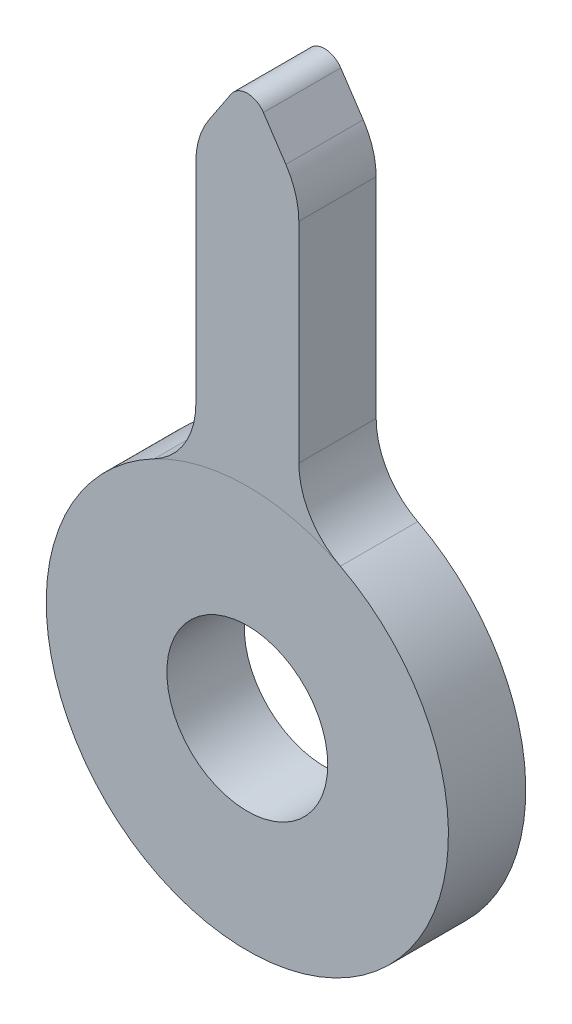
ISO-10303-21;
HEADER;
FILE_DESCRIPTION(('STEP AP214'),'2;1');
FILE_NAME('part.step','',(''),(''),'','','');
FILE_SCHEMA(('AUTOMOTIVE_DESIGN { 1 0 10303 214 1 1 1 1 }'));
ENDSEC;
DATA;
#1=APPLICATION_CONTEXT('core data for automotive mechanical design processes');
#2=APPLICATION_PROTOCOL_DEFINITION('international standard','automotive_design',2000,#1);
#3=PRODUCT_CONTEXT('',#1,'mechanical');
#4=PRODUCT('Part','Part','',(#3));
#5=PRODUCT_RELATED_PRODUCT_CATEGORY('part','',(#4));
#6=PRODUCT_DEFINITION_FORMATION('','',#4);
#7=PRODUCT_DEFINITION_CONTEXT('part definition',#1,'design');
#8=PRODUCT_DEFINITION('design','',#6,#7);
#9=PRODUCT_DEFINITION_SHAPE('','',#8);
#10=(LENGTH_UNIT() NAMED_UNIT(*) SI_UNIT(.MILLI.,.METRE.));
#11=(NAMED_UNIT(*) PLANE_ANGLE_UNIT() SI_UNIT($,.RADIAN.));
#12=(NAMED_UNIT(*) SI_UNIT($,.STERADIAN.) SOLID_ANGLE_UNIT());
#13=UNCERTAINTY_MEASURE_WITH_UNIT(LENGTH_MEASURE(1.E-05),#10,'distance_accuracy_value','');
#14=(GEOMETRIC_REPRESENTATION_CONTEXT(3) GLOBAL_UNCERTAINTY_ASSIGNED_CONTEXT((#13)) GLOBAL_UNIT_ASSIGNED_CONTEXT((#10,
#11,#12)) REPRESENTATION_CONTEXT('',''));
#15=CARTESIAN_POINT('',(0.,0.,0.));
#16=DIRECTION('',(0.,0.,1.));
#17=DIRECTION('',(1.,0.,0.));
#18=AXIS2_PLACEMENT_3D('',#15,#16,#17);
#19=CARTESIAN_POINT('',(0.,0.,1.5875));
#20=DIRECTION('',(0.,0.,1.));
#21=DIRECTION('',(1.,0.,0.));
#22=AXIS2_PLACEMENT_3D('',#19,#20,#21);
#23=PLANE('',#22);
#24=CARTESIAN_POINT('',(0.,0.,1.5875));
#25=DIRECTION('',(0.,0.,1.));
#26=DIRECTION('',(1.,0.,0.));
#27=AXIS2_PLACEMENT_3D('',#24,#25,#26);
#28=CIRCLE('',#27,1.651);
#29=CARTESIAN_POINT('',(1.651,0.,1.5875));
#30=VERTEX_POINT('',#29);
#31=EDGE_CURVE('E135',#30,#30,#28,.T.);
#32=ORIENTED_EDGE('',*,*,#31,.F.);
#33=EDGE_LOOP('',(#32));
#34=FACE_BOUND('',#33,.T.);
#35=CARTESIAN_POINT('',(0.,0.,1.5875));
#36=DIRECTION('',(0.,0.,1.));
#37=DIRECTION('',(1.,0.,0.));
#38=AXIS2_PLACEMENT_3D('',#35,#36,#37);
#39=CIRCLE('',#38,4.1275);
#40=CARTESIAN_POINT('',(1.90965429025841,3.65916339368682,1.5875));
#41=VERTEX_POINT('',#40);
#42=CARTESIAN_POINT('',(-1.90965666666667,3.65916215347934,1.5875));
#43=VERTEX_POINT('',#42);
#44=EDGE_CURVE('E51',#41,#43,#39,.T.);
#45=ORIENTED_EDGE('',*,*,#44,.T.);
#46=CARTESIAN_POINT('',(0.,0.,1.5875));
#47=DIRECTION('',(0.,0.,1.));
#48=DIRECTION('',(1.,0.,0.));
#49=AXIS2_PLACEMENT_3D('',#46,#47,#48);
#50=CIRCLE('',#49,4.1275);
#51=EDGE_CURVE('E204',#43,#41,#50,.T.);
#52=ORIENTED_EDGE('',*,*,#51,.T.);
#53=EDGE_LOOP('',(#45,#52));
#54=FACE_BOUND('',#53,.T.);
#55=ADVANCED_FACE('F36',(#34,#54),#23,.T.);
#56=DIRECTION('',(-0.554085305216421,0.832459893654479,0.));
#57=VECTOR('',#56,1.);
#58=CARTESIAN_POINT('',(0.,11.43,1.5875));
#59=LINE('',#58,#57);
#60=CARTESIAN_POINT('',(0.790670081176485,10.2420942290017,1.5875));
#61=VERTEX_POINT('',#60);
#62=CARTESIAN_POINT('',(0.330382520294121,10.9336320308081,1.5875));
#63=VERTEX_POINT('',#62);
#64=EDGE_CURVE('E128',#61,#63,#59,.T.);
#65=ORIENTED_EDGE('',*,*,#64,.T.);
#66=CARTESIAN_POINT('',(0.,10.7137294253003,1.5875));
#67=DIRECTION('',(0.,0.,1.));
#68=DIRECTION('',(1.,0.,0.));
#69=AXIS2_PLACEMENT_3D('',#66,#67,#68);
#70=CIRCLE('',#69,0.396875);
#71=CARTESIAN_POINT('',(-0.330382520294121,10.9336320308081,1.5875));
#72=VERTEX_POINT('',#71);
#73=EDGE_CURVE('E174',#63,#72,#70,.T.);
#74=ORIENTED_EDGE('',*,*,#73,.T.);
#75=DIRECTION('',(-0.554085305216421,-0.832459893654479,0.));
#76=VECTOR('',#75,1.);
#77=CARTESIAN_POINT('',(0.,11.43,1.5875));
#78=LINE('',#77,#76);
#79=CARTESIAN_POINT('',(-0.790670081176485,10.2420942290017,1.5875));
#80=VERTEX_POINT('',#79);
#81=EDGE_CURVE('E207',#72,#80,#78,.T.);
#82=ORIENTED_EDGE('',*,*,#81,.T.);
#83=CARTESIAN_POINT('',(0.53086,9.36248380697061,1.5875));
#84=DIRECTION('',(0.,0.,1.));
#85=DIRECTION('',(1.,0.,0.));
#86=AXIS2_PLACEMENT_3D('',#83,#84,#85);
#87=CIRCLE('',#86,1.5875);
#88=CARTESIAN_POINT('',(-1.05664,9.36248380697061,1.5875));
#89=VERTEX_POINT('',#88);
#90=EDGE_CURVE('E158',#80,#89,#87,.T.);
#91=ORIENTED_EDGE('',*,*,#90,.T.);
#92=DIRECTION('',(0.,-1.,0.));
#93=VECTOR('',#92,1.);
#94=CARTESIAN_POINT('',(-1.05664,3.98995841587353,1.5875));
#95=LINE('',#94,#93);
#96=CARTESIAN_POINT('',(-1.05664,5.06653221250985,1.5875));
#97=VERTEX_POINT('',#96);
#98=EDGE_CURVE('E205',#89,#97,#95,.T.);
#99=ORIENTED_EDGE('',*,*,#98,.T.);
#100=CARTESIAN_POINT('',(-2.64414,5.06653221250985,1.5875));
#101=DIRECTION('',(0.,0.,1.));
#102=DIRECTION('',(1.,0.,0.));
#103=AXIS2_PLACEMENT_3D('',#100,#101,#102);
#104=CIRCLE('',#103,1.5875);
#105=EDGE_CURVE('E189',#97,#43,#104,.F.);
#106=ORIENTED_EDGE('',*,*,#105,.T.);
#107=ORIENTED_EDGE('',*,*,#44,.F.);
#108=CARTESIAN_POINT('',(2.64414,5.06653221250985,1.5875));
#109=DIRECTION('',(0.,0.,1.));
#110=DIRECTION('',(1.,0.,0.));
#111=AXIS2_PLACEMENT_3D('',#108,#109,#110);
#112=CIRCLE('',#111,1.5875);
#113=CARTESIAN_POINT('',(1.05664,5.06653221250985,1.5875));
#114=VERTEX_POINT('',#113);
#115=EDGE_CURVE('E11',#41,#114,#112,.F.);
#116=ORIENTED_EDGE('',*,*,#115,.T.);
#117=DIRECTION('',(0.,1.,0.));
#118=VECTOR('',#117,1.);
#119=CARTESIAN_POINT('',(1.05664,3.98995841587353,1.5875));
#120=LINE('',#119,#118);
#121=CARTESIAN_POINT('',(1.05664,9.36248380697061,1.5875));
#122=VERTEX_POINT('',#121);
#123=EDGE_CURVE('E143',#114,#122,#120,.T.);
#124=ORIENTED_EDGE('',*,*,#123,.T.);
#125=CARTESIAN_POINT('',(-0.53086,9.36248380697061,1.5875));
#126=DIRECTION('',(0.,0.,1.));
#127=DIRECTION('',(1.,0.,0.));
#128=AXIS2_PLACEMENT_3D('',#125,#126,#127);
#129=CIRCLE('',#128,1.5875);
#130=EDGE_CURVE('E160',#122,#61,#129,.T.);
#131=ORIENTED_EDGE('',*,*,#130,.T.);
#132=EDGE_LOOP('',(#65,#74,#82,#91,#99,#106,#107,#116,#124,#131));
#133=FACE_BOUND('',#132,.T.);
#134=ADVANCED_FACE('F201',(#133),#23,.T.);
#135=CARTESIAN_POINT('',(0.,0.,0.));
#136=DIRECTION('',(0.,0.,1.));
#137=DIRECTION('',(1.,0.,0.));
#138=AXIS2_PLACEMENT_3D('',#135,#136,#137);
#139=PLANE('',#138);
#140=DIRECTION('',(-0.554085305216421,-0.832459893654479,0.));
#141=VECTOR('',#140,1.);
#142=CARTESIAN_POINT('',(0.,11.43,0.));
#143=LINE('',#142,#141);
#144=CARTESIAN_POINT('',(-0.330382520294121,10.9336320308081,0.));
#145=VERTEX_POINT('',#144);
#146=CARTESIAN_POINT('',(-0.790670081176485,10.2420942290017,0.));
#147=VERTEX_POINT('',#146);
#148=EDGE_CURVE('E134',#145,#147,#143,.T.);
#149=ORIENTED_EDGE('',*,*,#148,.F.);
#150=CARTESIAN_POINT('',(0.,10.7137294253003,0.));
#151=DIRECTION('',(0.,0.,1.));
#152=DIRECTION('',(1.,0.,0.));
#153=AXIS2_PLACEMENT_3D('',#150,#151,#152);
#154=CIRCLE('',#153,0.396875);
#155=CARTESIAN_POINT('',(0.330382520294121,10.9336320308081,0.));
#156=VERTEX_POINT('',#155);
#157=EDGE_CURVE('E133',#145,#156,#154,.F.);
#158=ORIENTED_EDGE('',*,*,#157,.T.);
#159=DIRECTION('',(-0.554085305216421,0.832459893654479,0.));
#160=VECTOR('',#159,1.);
#161=CARTESIAN_POINT('',(0.,11.43,0.));
#162=LINE('',#161,#160);
#163=CARTESIAN_POINT('',(0.790670081176485,10.2420942290017,0.));
#164=VERTEX_POINT('',#163);
#165=EDGE_CURVE('E125',#164,#156,#162,.T.);
#166=ORIENTED_EDGE('',*,*,#165,.F.);
#167=CARTESIAN_POINT('',(-0.53086,9.36248380697061,0.));
#168=DIRECTION('',(0.,0.,1.));
#169=DIRECTION('',(1.,0.,0.));
#170=AXIS2_PLACEMENT_3D('',#167,#168,#169);
#171=CIRCLE('',#170,1.5875);
#172=CARTESIAN_POINT('',(1.05664,9.36248380697061,0.));
#173=VERTEX_POINT('',#172);
#174=EDGE_CURVE('E109',#164,#173,#171,.F.);
#175=ORIENTED_EDGE('',*,*,#174,.T.);
#176=DIRECTION('',(0.,1.,0.));
#177=VECTOR('',#176,1.);
#178=CARTESIAN_POINT('',(1.05664,3.98995841587353,0.));
#179=LINE('',#178,#177);
#180=CARTESIAN_POINT('',(1.05664,5.06653221250985,0.));
#181=VERTEX_POINT('',#180);
#182=EDGE_CURVE('E151',#181,#173,#179,.T.);
#183=ORIENTED_EDGE('',*,*,#182,.F.);
#184=CARTESIAN_POINT('',(2.64414,5.06653221250985,0.));
#185=DIRECTION('',(0.,0.,1.));
#186=DIRECTION('',(1.,0.,0.));
#187=AXIS2_PLACEMENT_3D('',#184,#185,#186);
#188=CIRCLE('',#187,1.5875);
#189=CARTESIAN_POINT('',(1.90965666666667,3.65916215347934,0.));
#190=VERTEX_POINT('',#189);
#191=EDGE_CURVE('E45',#181,#190,#188,.T.);
#192=ORIENTED_EDGE('',*,*,#191,.T.);
#193=CARTESIAN_POINT('',(0.,0.,0.));
#194=DIRECTION('',(0.,0.,1.));
#195=DIRECTION('',(1.,0.,0.));
#196=AXIS2_PLACEMENT_3D('',#193,#194,#195);
#197=CIRCLE('',#196,4.1275);
#198=CARTESIAN_POINT('',(-1.90965666666667,3.65916215347934,0.));
#199=VERTEX_POINT('',#198);
#200=EDGE_CURVE('E148',#199,#190,#197,.T.);
#201=ORIENTED_EDGE('',*,*,#200,.F.);
#202=CARTESIAN_POINT('',(-2.64414,5.06653221250985,0.));
#203=DIRECTION('',(0.,0.,1.));
#204=DIRECTION('',(1.,0.,0.));
#205=AXIS2_PLACEMENT_3D('',#202,#203,#204);
#206=CIRCLE('',#205,1.5875);
#207=CARTESIAN_POINT('',(-1.05664,5.06653221250985,0.));
#208=VERTEX_POINT('',#207);
#209=EDGE_CURVE('E187',#199,#208,#206,.T.);
#210=ORIENTED_EDGE('',*,*,#209,.T.);
#211=DIRECTION('',(0.,-1.,0.));
#212=VECTOR('',#211,1.);
#213=CARTESIAN_POINT('',(-1.05664,3.98995841587353,0.));
#214=LINE('',#213,#212);
#215=CARTESIAN_POINT('',(-1.05664,9.36248380697061,0.));
#216=VERTEX_POINT('',#215);
#217=EDGE_CURVE('E137',#216,#208,#214,.T.);
#218=ORIENTED_EDGE('',*,*,#217,.F.);
#219=CARTESIAN_POINT('',(0.53086,9.36248380697061,0.));
#220=DIRECTION('',(0.,0.,1.));
#221=DIRECTION('',(1.,0.,0.));
#222=AXIS2_PLACEMENT_3D('',#219,#220,#221);
#223=CIRCLE('',#222,1.5875);
#224=EDGE_CURVE('E119',#216,#147,#223,.F.);
#225=ORIENTED_EDGE('',*,*,#224,.T.);
#226=EDGE_LOOP('',(#149,#158,#166,#175,#183,#192,#201,#210,#218,#225));
#227=FACE_BOUND('',#226,.T.);
#228=CARTESIAN_POINT('',(0.,0.,0.));
#229=DIRECTION('',(0.,0.,1.));
#230=DIRECTION('',(1.,0.,0.));
#231=AXIS2_PLACEMENT_3D('',#228,#229,#230);
#232=CIRCLE('',#231,1.651);
#233=CARTESIAN_POINT('',(1.651,0.,0.));
#234=VERTEX_POINT('',#233);
#235=EDGE_CURVE('E140',#234,#234,#232,.T.);
#236=ORIENTED_EDGE('',*,*,#235,.T.);
#237=EDGE_LOOP('',(#236));
#238=FACE_BOUND('',#237,.T.);
#239=ADVANCED_FACE('F131',(#227,#238),#139,.F.);
#240=CARTESIAN_POINT('',(0.,11.43,1.5875));
#241=DIRECTION('',(-0.832459893654478,-0.554085305216421,0.));
#242=DIRECTION('',(0.554085305216421,-0.832459893654479,0.));
#243=AXIS2_PLACEMENT_3D('',#240,#241,#242);
#244=PLANE('',#243);
#245=ORIENTED_EDGE('',*,*,#165,.T.);
#246=DIRECTION('',(0.,0.,-1.));
#247=VECTOR('',#246,1.);
#248=CARTESIAN_POINT('',(0.330382520294121,10.9336320308081,1.5875));
#249=LINE('',#248,#247);
#250=EDGE_CURVE('E172',#156,#63,#249,.F.);
#251=ORIENTED_EDGE('',*,*,#250,.T.);
#252=ORIENTED_EDGE('',*,*,#64,.F.);
#253=DIRECTION('',(0.,0.,-1.));
#254=VECTOR('',#253,1.);
#255=CARTESIAN_POINT('',(0.790670081176485,10.2420942290017,1.5875));
#256=LINE('',#255,#254);
#257=EDGE_CURVE('E113',#61,#164,#256,.T.);
#258=ORIENTED_EDGE('',*,*,#257,.T.);
#259=EDGE_LOOP('',(#245,#251,#252,#258));
#260=FACE_BOUND('',#259,.T.);
#261=ADVANCED_FACE('F124',(#260),#244,.F.);
#262=CARTESIAN_POINT('',(0.,11.43,1.5875));
#263=DIRECTION('',(0.832459893654478,-0.554085305216421,0.));
#264=DIRECTION('',(0.554085305216421,0.832459893654479,0.));
#265=AXIS2_PLACEMENT_3D('',#262,#263,#264);
#266=PLANE('',#265);
#267=ORIENTED_EDGE('',*,*,#81,.F.);
#268=DIRECTION('',(0.,0.,-1.));
#269=VECTOR('',#268,1.);
#270=CARTESIAN_POINT('',(-0.330382520294121,10.9336320308081,1.5875));
#271=LINE('',#270,#269);
#272=EDGE_CURVE('E168',#72,#145,#271,.T.);
#273=ORIENTED_EDGE('',*,*,#272,.T.);
#274=ORIENTED_EDGE('',*,*,#148,.T.);
#275=DIRECTION('',(0.,0.,-1.));
#276=VECTOR('',#275,1.);
#277=CARTESIAN_POINT('',(-0.790670081176485,10.2420942290017,1.5875));
#278=LINE('',#277,#276);
#279=EDGE_CURVE('E165',#147,#80,#278,.F.);
#280=ORIENTED_EDGE('',*,*,#279,.T.);
#281=EDGE_LOOP('',(#267,#273,#274,#280));
#282=FACE_BOUND('',#281,.T.);
#283=ADVANCED_FACE('F241',(#282),#266,.F.);
#284=CARTESIAN_POINT('',(-1.05664,3.98995841587353,1.5875));
#285=DIRECTION('',(1.,0.,0.));
#286=DIRECTION('',(0.,0.,-1.));
#287=AXIS2_PLACEMENT_3D('',#284,#285,#286);
#288=PLANE('',#287);
#289=ORIENTED_EDGE('',*,*,#217,.T.);
#290=DIRECTION('',(0.,0.,1.));
#291=VECTOR('',#290,1.);
#292=CARTESIAN_POINT('',(-1.05664,5.06653221250985,1.5875));
#293=LINE('',#292,#291);
#294=EDGE_CURVE('E182',#208,#97,#293,.T.);
#295=ORIENTED_EDGE('',*,*,#294,.T.);
#296=ORIENTED_EDGE('',*,*,#98,.F.);
#297=DIRECTION('',(0.,0.,-1.));
#298=VECTOR('',#297,1.);
#299=CARTESIAN_POINT('',(-1.05664,9.36248380697061,1.5875));
#300=LINE('',#299,#298);
#301=EDGE_CURVE('E162',#89,#216,#300,.T.);
#302=ORIENTED_EDGE('',*,*,#301,.T.);
#303=EDGE_LOOP('',(#289,#295,#296,#302));
#304=FACE_BOUND('',#303,.T.);
#305=ADVANCED_FACE('F238',(#304),#288,.F.);
#306=CARTESIAN_POINT('',(0.,0.,1.5875));
#307=DIRECTION('',(0.,0.,-1.));
#308=DIRECTION('',(-1.,0.,0.));
#309=AXIS2_PLACEMENT_3D('',#306,#307,#308);
#310=CYLINDRICAL_SURFACE('',#309,4.1275);
#311=ORIENTED_EDGE('',*,*,#51,.F.);
#312=DIRECTION('',(0.,0.,-1.));
#313=VECTOR('',#312,1.);
#314=CARTESIAN_POINT('',(-1.90965666666667,3.65916215347934,1.5875));
#315=LINE('',#314,#313);
#316=EDGE_CURVE('E179',#43,#199,#315,.T.);
#317=ORIENTED_EDGE('',*,*,#316,.T.);
#318=ORIENTED_EDGE('',*,*,#200,.T.);
#319=DIRECTION('',(0.,0.,-1.));
#320=VECTOR('',#319,1.);
#321=CARTESIAN_POINT('',(1.90965666666667,3.65916215347934,1.5875));
#322=LINE('',#321,#320);
#323=EDGE_CURVE('E176',#190,#41,#322,.F.);
#324=ORIENTED_EDGE('',*,*,#323,.T.);
#325=EDGE_LOOP('',(#311,#317,#318,#324));
#326=FACE_BOUND('',#325,.T.);
#327=ADVANCED_FACE('F196',(#326),#310,.T.);
#328=CARTESIAN_POINT('',(1.05664,3.98995841587353,1.5875));
#329=DIRECTION('',(-1.,0.,0.));
#330=DIRECTION('',(0.,0.,1.));
#331=AXIS2_PLACEMENT_3D('',#328,#329,#330);
#332=PLANE('',#331);
#333=ORIENTED_EDGE('',*,*,#123,.F.);
#334=DIRECTION('',(0.,0.,1.));
#335=VECTOR('',#334,1.);
#336=CARTESIAN_POINT('',(1.05664,5.06653221250985,0.));
#337=LINE('',#336,#335);
#338=EDGE_CURVE('E184',#114,#181,#337,.F.);
#339=ORIENTED_EDGE('',*,*,#338,.T.);
#340=ORIENTED_EDGE('',*,*,#182,.T.);
#341=DIRECTION('',(0.,0.,-1.));
#342=VECTOR('',#341,1.);
#343=CARTESIAN_POINT('',(1.05664,9.36248380697061,1.5875));
#344=LINE('',#343,#342);
#345=EDGE_CURVE('E115',#173,#122,#344,.F.);
#346=ORIENTED_EDGE('',*,*,#345,.T.);
#347=EDGE_LOOP('',(#333,#339,#340,#346));
#348=FACE_BOUND('',#347,.T.);
#349=ADVANCED_FACE('F203',(#348),#332,.F.);
#350=CARTESIAN_POINT('',(0.,0.,1.5875));
#351=DIRECTION('',(0.,0.,-1.));
#352=DIRECTION('',(-1.,0.,0.));
#353=AXIS2_PLACEMENT_3D('',#350,#351,#352);
#354=CYLINDRICAL_SURFACE('',#353,1.651);
#355=ORIENTED_EDGE('',*,*,#31,.T.);
#356=EDGE_LOOP('',(#355));
#357=FACE_BOUND('',#356,.T.);
#358=ORIENTED_EDGE('',*,*,#235,.F.);
#359=EDGE_LOOP('',(#358));
#360=FACE_BOUND('',#359,.T.);
#361=ADVANCED_FACE('F215',(#357,#360),#354,.F.);
#362=CARTESIAN_POINT('',(-0.53086,9.36248380697061,1.5875));
#363=DIRECTION('',(0.,0.,-1.));
#364=DIRECTION('',(-1.,0.,0.));
#365=AXIS2_PLACEMENT_3D('',#362,#363,#364);
#366=CYLINDRICAL_SURFACE('',#365,1.5875);
#367=ORIENTED_EDGE('',*,*,#130,.F.);
#368=ORIENTED_EDGE('',*,*,#345,.F.);
#369=ORIENTED_EDGE('',*,*,#174,.F.);
#370=ORIENTED_EDGE('',*,*,#257,.F.);
#371=EDGE_LOOP('',(#367,#368,#369,#370));
#372=FACE_BOUND('',#371,.T.);
#373=ADVANCED_FACE('F112',(#372),#366,.T.);
#374=CARTESIAN_POINT('',(0.53086,9.36248380697061,1.5875));
#375=DIRECTION('',(0.,0.,-1.));
#376=DIRECTION('',(-1.,0.,0.));
#377=AXIS2_PLACEMENT_3D('',#374,#375,#376);
#378=CYLINDRICAL_SURFACE('',#377,1.5875);
#379=ORIENTED_EDGE('',*,*,#90,.F.);
#380=ORIENTED_EDGE('',*,*,#279,.F.);
#381=ORIENTED_EDGE('',*,*,#224,.F.);
#382=ORIENTED_EDGE('',*,*,#301,.F.);
#383=EDGE_LOOP('',(#379,#380,#381,#382));
#384=FACE_BOUND('',#383,.T.);
#385=ADVANCED_FACE('F223',(#384),#378,.T.);
#386=CARTESIAN_POINT('',(0.,10.7137294253003,1.5875));
#387=DIRECTION('',(0.,0.,-1.));
#388=DIRECTION('',(-1.,0.,0.));
#389=AXIS2_PLACEMENT_3D('',#386,#387,#388);
#390=CYLINDRICAL_SURFACE('',#389,0.396875);
#391=ORIENTED_EDGE('',*,*,#73,.F.);
#392=ORIENTED_EDGE('',*,*,#250,.F.);
#393=ORIENTED_EDGE('',*,*,#157,.F.);
#394=ORIENTED_EDGE('',*,*,#272,.F.);
#395=EDGE_LOOP('',(#391,#392,#393,#394));
#396=FACE_BOUND('',#395,.T.);
#397=ADVANCED_FACE('F250',(#396),#390,.T.);
#398=CARTESIAN_POINT('',(-2.64414,5.06653221250985,1.5875));
#399=DIRECTION('',(0.,0.,-1.));
#400=DIRECTION('',(-1.,0.,0.));
#401=AXIS2_PLACEMENT_3D('',#398,#399,#400);
#402=CYLINDRICAL_SURFACE('',#401,1.5875);
#403=ORIENTED_EDGE('',*,*,#105,.F.);
#404=ORIENTED_EDGE('',*,*,#294,.F.);
#405=ORIENTED_EDGE('',*,*,#209,.F.);
#406=ORIENTED_EDGE('',*,*,#316,.F.);
#407=EDGE_LOOP('',(#403,#404,#405,#406));
#408=FACE_BOUND('',#407,.T.);
#409=ADVANCED_FACE('F253',(#408),#402,.F.);
#410=CARTESIAN_POINT('',(2.64414,5.06653221250985,1.5875));
#411=DIRECTION('',(0.,0.,-1.));
#412=DIRECTION('',(-1.,0.,0.));
#413=AXIS2_PLACEMENT_3D('',#410,#411,#412);
#414=CYLINDRICAL_SURFACE('',#413,1.5875);
#415=ORIENTED_EDGE('',*,*,#115,.F.);
#416=ORIENTED_EDGE('',*,*,#323,.F.);
#417=ORIENTED_EDGE('',*,*,#191,.F.);
#418=ORIENTED_EDGE('',*,*,#338,.F.);
#419=EDGE_LOOP('',(#415,#416,#417,#418));
#420=FACE_BOUND('',#419,.T.);
#421=ADVANCED_FACE('F38',(#420),#414,.F.);
#422=CLOSED_SHELL('',(#55,#134,#239,#261,#283,#305,#327,#349,#361,#373,#385,#397,#409,#421));
#423=MANIFOLD_SOLID_BREP('B2',#422);
#424=ADVANCED_BREP_SHAPE_REPRESENTATION('',(#18,#423),#14);
#425=SHAPE_DEFINITION_REPRESENTATION(#9,#424);
ENDSEC;
END-ISO-10303-21;
